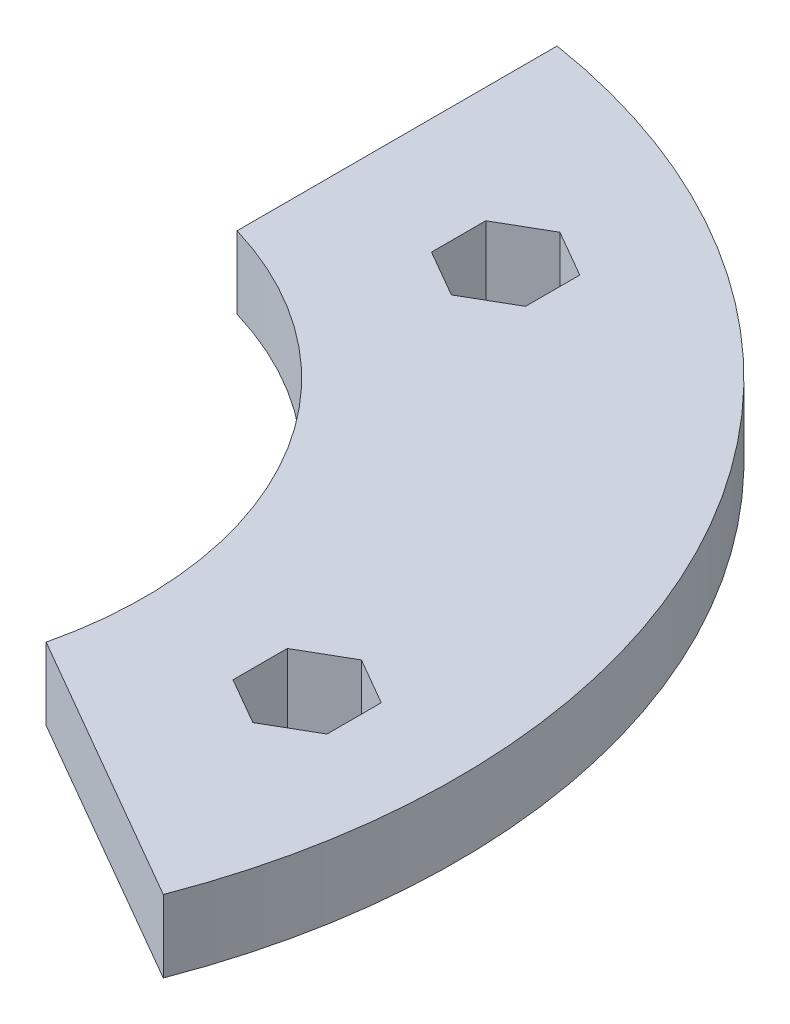
ISO-10303-21;
HEADER;
FILE_DESCRIPTION(('STEP AP214'),'2;1');
FILE_NAME('part.step','',(''),(''),'','','');
FILE_SCHEMA(('AUTOMOTIVE_DESIGN { 1 0 10303 214 1 1 1 1 }'));
ENDSEC;
DATA;
#1=APPLICATION_CONTEXT('core data for automotive mechanical design processes');
#2=APPLICATION_PROTOCOL_DEFINITION('international standard','automotive_design',2000,#1);
#3=PRODUCT_CONTEXT('',#1,'mechanical');
#4=PRODUCT('Part','Part','',(#3));
#5=PRODUCT_RELATED_PRODUCT_CATEGORY('part','',(#4));
#6=PRODUCT_DEFINITION_FORMATION('','',#4);
#7=PRODUCT_DEFINITION_CONTEXT('part definition',#1,'design');
#8=PRODUCT_DEFINITION('design','',#6,#7);
#9=PRODUCT_DEFINITION_SHAPE('','',#8);
#10=(LENGTH_UNIT() NAMED_UNIT(*) SI_UNIT(.MILLI.,.METRE.));
#11=(NAMED_UNIT(*) PLANE_ANGLE_UNIT() SI_UNIT($,.RADIAN.));
#12=(NAMED_UNIT(*) SI_UNIT($,.STERADIAN.) SOLID_ANGLE_UNIT());
#13=UNCERTAINTY_MEASURE_WITH_UNIT(LENGTH_MEASURE(1.E-05),#10,'distance_accuracy_value','');
#14=(GEOMETRIC_REPRESENTATION_CONTEXT(3) GLOBAL_UNCERTAINTY_ASSIGNED_CONTEXT((#13)) GLOBAL_UNIT_ASSIGNED_CONTEXT((#10,
#11,#12)) REPRESENTATION_CONTEXT('',''));
#15=CARTESIAN_POINT('',(0.,0.,0.));
#16=DIRECTION('',(0.,0.,1.));
#17=DIRECTION('',(1.,0.,0.));
#18=AXIS2_PLACEMENT_3D('',#15,#16,#17);
#19=CARTESIAN_POINT('',(0.,4.,0.));
#20=DIRECTION('',(0.,1.,0.));
#21=DIRECTION('',(0.,0.,1.));
#22=AXIS2_PLACEMENT_3D('',#19,#20,#21);
#23=PLANE('',#22);
#24=DIRECTION('',(0.,0.,1.));
#25=VECTOR('',#24,1.);
#26=CARTESIAN_POINT('',(12.4,4.,-27.4818728134262));
#27=LINE('',#26,#25);
#28=CARTESIAN_POINT('',(12.4,4.,-27.4818728134262));
#29=VERTEX_POINT('',#28);
#30=CARTESIAN_POINT('',(12.4,4.,-24.4796514136402));
#31=VERTEX_POINT('',#30);
#32=EDGE_CURVE('E258',#29,#31,#27,.T.);
#33=ORIENTED_EDGE('',*,*,#32,.F.);
#34=DIRECTION('',(-0.866025403784439,0.,0.5));
#35=VECTOR('',#34,1.);
#36=CARTESIAN_POINT('',(15.,4.,-28.9829835133192));
#37=LINE('',#36,#35);
#38=CARTESIAN_POINT('',(15.,4.,-28.9829835133192));
#39=VERTEX_POINT('',#38);
#40=EDGE_CURVE('E234',#39,#29,#37,.T.);
#41=ORIENTED_EDGE('',*,*,#40,.F.);
#42=DIRECTION('',(-0.866025403784441,0.,-0.499999999999997));
#43=VECTOR('',#42,1.);
#44=CARTESIAN_POINT('',(17.6,4.,-27.4818728134262));
#45=LINE('',#44,#43);
#46=CARTESIAN_POINT('',(17.6,4.,-27.4818728134262));
#47=VERTEX_POINT('',#46);
#48=EDGE_CURVE('E230',#47,#39,#45,.T.);
#49=ORIENTED_EDGE('',*,*,#48,.F.);
#50=DIRECTION('',(0.,0.,-1.));
#51=VECTOR('',#50,1.);
#52=CARTESIAN_POINT('',(17.6,4.,-24.4796514136402));
#53=LINE('',#52,#51);
#54=CARTESIAN_POINT('',(17.6,4.,-24.4796514136402));
#55=VERTEX_POINT('',#54);
#56=EDGE_CURVE('E251',#55,#47,#53,.T.);
#57=ORIENTED_EDGE('',*,*,#56,.F.);
#58=DIRECTION('',(0.866025403784438,0.,-0.5));
#59=VECTOR('',#58,1.);
#60=CARTESIAN_POINT('',(15.,4.,-22.9785407137471));
#61=LINE('',#60,#59);
#62=CARTESIAN_POINT('',(15.,4.,-22.9785407137471));
#63=VERTEX_POINT('',#62);
#64=EDGE_CURVE('E254',#63,#55,#61,.T.);
#65=ORIENTED_EDGE('',*,*,#64,.F.);
#66=DIRECTION('',(0.866025403784439,0.,0.499999999999999));
#67=VECTOR('',#66,1.);
#68=CARTESIAN_POINT('',(12.4,4.,-24.4796514136402));
#69=LINE('',#68,#67);
#70=EDGE_CURVE('E256',#31,#63,#69,.T.);
#71=ORIENTED_EDGE('',*,*,#70,.F.);
#72=EDGE_LOOP('',(#33,#41,#49,#57,#65,#71));
#73=FACE_BOUND('',#72,.T.);
#74=DIRECTION('',(-0.866025403784438,0.,0.5));
#75=VECTOR('',#74,1.);
#76=CARTESIAN_POINT('',(30.,4.,-3.00222139978605));
#77=LINE('',#76,#75);
#78=CARTESIAN_POINT('',(30.,4.,-3.00222139978605));
#79=VERTEX_POINT('',#78);
#80=CARTESIAN_POINT('',(27.4,4.,-1.50111069989303));
#81=VERTEX_POINT('',#80);
#82=EDGE_CURVE('E214',#79,#81,#77,.T.);
#83=ORIENTED_EDGE('',*,*,#82,.F.);
#84=DIRECTION('',(-0.866025403784439,0.,-0.5));
#85=VECTOR('',#84,1.);
#86=CARTESIAN_POINT('',(32.6,4.,-1.50111069989302));
#87=LINE('',#86,#85);
#88=CARTESIAN_POINT('',(32.6,4.,-1.50111069989302));
#89=VERTEX_POINT('',#88);
#90=EDGE_CURVE('E189',#89,#79,#87,.T.);
#91=ORIENTED_EDGE('',*,*,#90,.F.);
#92=DIRECTION('',(0.,0.,-1.));
#93=VECTOR('',#92,1.);
#94=CARTESIAN_POINT('',(32.6,4.,1.50111069989303));
#95=LINE('',#94,#93);
#96=CARTESIAN_POINT('',(32.6,4.,1.50111069989303));
#97=VERTEX_POINT('',#96);
#98=EDGE_CURVE('E185',#97,#89,#95,.T.);
#99=ORIENTED_EDGE('',*,*,#98,.F.);
#100=DIRECTION('',(0.866025403784439,0.,-0.5));
#101=VECTOR('',#100,1.);
#102=CARTESIAN_POINT('',(30.,4.,3.00222139978606));
#103=LINE('',#102,#101);
#104=CARTESIAN_POINT('',(30.,4.,3.00222139978606));
#105=VERTEX_POINT('',#104);
#106=EDGE_CURVE('E207',#105,#97,#103,.T.);
#107=ORIENTED_EDGE('',*,*,#106,.F.);
#108=DIRECTION('',(0.866025403784438,0.,0.5));
#109=VECTOR('',#108,1.);
#110=CARTESIAN_POINT('',(27.4,4.,1.50111069989303));
#111=LINE('',#110,#109);
#112=CARTESIAN_POINT('',(27.4,4.,1.50111069989303));
#113=VERTEX_POINT('',#112);
#114=EDGE_CURVE('E210',#113,#105,#111,.T.);
#115=ORIENTED_EDGE('',*,*,#114,.F.);
#116=DIRECTION('',(0.,0.,1.));
#117=VECTOR('',#116,1.);
#118=CARTESIAN_POINT('',(27.4,4.,-1.50111069989303));
#119=LINE('',#118,#117);
#120=EDGE_CURVE('E212',#81,#113,#119,.T.);
#121=ORIENTED_EDGE('',*,*,#120,.F.);
#122=EDGE_LOOP('',(#83,#91,#99,#107,#115,#121));
#123=FACE_BOUND('',#122,.T.);
#124=CARTESIAN_POINT('',(0.,4.,0.));
#125=DIRECTION('',(0.,1.,0.));
#126=DIRECTION('',(0.,0.,1.));
#127=AXIS2_PLACEMENT_3D('',#124,#125,#126);
#128=CIRCLE('',#127,38.3);
#129=CARTESIAN_POINT('',(35.7592353390612,4.,13.7174009187469));
#130=VERTEX_POINT('',#129);
#131=CARTESIAN_POINT('',(6.,4.,-37.8271066829066));
#132=VERTEX_POINT('',#131);
#133=EDGE_CURVE('E156',#130,#132,#128,.T.);
#134=ORIENTED_EDGE('',*,*,#133,.T.);
#135=DIRECTION('',(0.,0.,1.));
#136=VECTOR('',#135,1.);
#137=CARTESIAN_POINT('',(6.,4.,-50.2763023357895));
#138=LINE('',#137,#136);
#139=CARTESIAN_POINT('',(6.,4.,-20.1246117974981));
#140=VERTEX_POINT('',#139);
#141=EDGE_CURVE('E159',#132,#140,#138,.T.);
#142=ORIENTED_EDGE('',*,*,#141,.T.);
#143=CARTESIAN_POINT('',(0.,4.,0.));
#144=DIRECTION('',(0.,1.,0.));
#145=DIRECTION('',(0.,0.,1.));
#146=AXIS2_PLACEMENT_3D('',#143,#144,#145);
#147=CIRCLE('',#146,21.);
#148=CARTESIAN_POINT('',(20.4284250579334,4.,4.86615347604252));
#149=VERTEX_POINT('',#148);
#150=EDGE_CURVE('E158',#149,#140,#147,.T.);
#151=ORIENTED_EDGE('',*,*,#150,.F.);
#152=DIRECTION('',(0.866025403784436,0.,0.500000000000004));
#153=VECTOR('',#152,1.);
#154=CARTESIAN_POINT('',(15.3820042044027,4.,1.95260103781242));
#155=LINE('',#154,#153);
#156=EDGE_CURVE('E55',#149,#130,#155,.T.);
#157=ORIENTED_EDGE('',*,*,#156,.T.);
#158=EDGE_LOOP('',(#134,#142,#151,#157));
#159=FACE_BOUND('',#158,.T.);
#160=ADVANCED_FACE('F33',(#73,#123,#159),#23,.T.);
#161=CARTESIAN_POINT('',(0.,0.,0.));
#162=DIRECTION('',(0.,1.,0.));
#163=DIRECTION('',(0.,0.,1.));
#164=AXIS2_PLACEMENT_3D('',#161,#162,#163);
#165=PLANE('',#164);
#166=DIRECTION('',(-0.866025403784439,0.,0.5));
#167=VECTOR('',#166,1.);
#168=CARTESIAN_POINT('',(15.,0.,-28.9829835133192));
#169=LINE('',#168,#167);
#170=CARTESIAN_POINT('',(15.,0.,-28.9829835133192));
#171=VERTEX_POINT('',#170);
#172=CARTESIAN_POINT('',(12.4,0.,-27.4818728134262));
#173=VERTEX_POINT('',#172);
#174=EDGE_CURVE('E247',#171,#173,#169,.T.);
#175=ORIENTED_EDGE('',*,*,#174,.T.);
#176=DIRECTION('',(0.,0.,1.));
#177=VECTOR('',#176,1.);
#178=CARTESIAN_POINT('',(12.4,0.,-27.4818728134262));
#179=LINE('',#178,#177);
#180=CARTESIAN_POINT('',(12.4,0.,-24.4796514136402));
#181=VERTEX_POINT('',#180);
#182=EDGE_CURVE('E244',#173,#181,#179,.T.);
#183=ORIENTED_EDGE('',*,*,#182,.T.);
#184=DIRECTION('',(0.866025403784439,0.,0.499999999999999));
#185=VECTOR('',#184,1.);
#186=CARTESIAN_POINT('',(12.4,0.,-24.4796514136402));
#187=LINE('',#186,#185);
#188=CARTESIAN_POINT('',(15.,0.,-22.9785407137471));
#189=VERTEX_POINT('',#188);
#190=EDGE_CURVE('E241',#181,#189,#187,.T.);
#191=ORIENTED_EDGE('',*,*,#190,.T.);
#192=DIRECTION('',(0.866025403784438,0.,-0.5));
#193=VECTOR('',#192,1.);
#194=CARTESIAN_POINT('',(15.,0.,-22.9785407137471));
#195=LINE('',#194,#193);
#196=CARTESIAN_POINT('',(17.6,0.,-24.4796514136402));
#197=VERTEX_POINT('',#196);
#198=EDGE_CURVE('E238',#189,#197,#195,.T.);
#199=ORIENTED_EDGE('',*,*,#198,.T.);
#200=DIRECTION('',(0.,0.,-1.));
#201=VECTOR('',#200,1.);
#202=CARTESIAN_POINT('',(17.6,0.,-24.4796514136402));
#203=LINE('',#202,#201);
#204=CARTESIAN_POINT('',(17.6,0.,-27.4818728134262));
#205=VERTEX_POINT('',#204);
#206=EDGE_CURVE('E235',#197,#205,#203,.T.);
#207=ORIENTED_EDGE('',*,*,#206,.T.);
#208=DIRECTION('',(-0.866025403784441,0.,-0.499999999999997));
#209=VECTOR('',#208,1.);
#210=CARTESIAN_POINT('',(17.6,0.,-27.4818728134262));
#211=LINE('',#210,#209);
#212=EDGE_CURVE('E231',#205,#171,#211,.T.);
#213=ORIENTED_EDGE('',*,*,#212,.T.);
#214=EDGE_LOOP('',(#175,#183,#191,#199,#207,#213));
#215=FACE_BOUND('',#214,.T.);
#216=DIRECTION('',(-0.866025403784439,0.,-0.5));
#217=VECTOR('',#216,1.);
#218=CARTESIAN_POINT('',(32.6,0.,-1.50111069989302));
#219=LINE('',#218,#217);
#220=CARTESIAN_POINT('',(32.6,0.,-1.50111069989302));
#221=VERTEX_POINT('',#220);
#222=CARTESIAN_POINT('',(30.,0.,-3.00222139978605));
#223=VERTEX_POINT('',#222);
#224=EDGE_CURVE('E202',#221,#223,#219,.T.);
#225=ORIENTED_EDGE('',*,*,#224,.T.);
#226=DIRECTION('',(-0.866025403784438,0.,0.5));
#227=VECTOR('',#226,1.);
#228=CARTESIAN_POINT('',(30.,0.,-3.00222139978605));
#229=LINE('',#228,#227);
#230=CARTESIAN_POINT('',(27.4,0.,-1.50111069989303));
#231=VERTEX_POINT('',#230);
#232=EDGE_CURVE('E199',#223,#231,#229,.T.);
#233=ORIENTED_EDGE('',*,*,#232,.T.);
#234=DIRECTION('',(0.,0.,1.));
#235=VECTOR('',#234,1.);
#236=CARTESIAN_POINT('',(27.4,0.,-1.50111069989303));
#237=LINE('',#236,#235);
#238=CARTESIAN_POINT('',(27.4,0.,1.50111069989303));
#239=VERTEX_POINT('',#238);
#240=EDGE_CURVE('E196',#231,#239,#237,.T.);
#241=ORIENTED_EDGE('',*,*,#240,.T.);
#242=DIRECTION('',(0.866025403784438,0.,0.5));
#243=VECTOR('',#242,1.);
#244=CARTESIAN_POINT('',(27.4,0.,1.50111069989303));
#245=LINE('',#244,#243);
#246=CARTESIAN_POINT('',(30.,0.,3.00222139978606));
#247=VERTEX_POINT('',#246);
#248=EDGE_CURVE('E193',#239,#247,#245,.T.);
#249=ORIENTED_EDGE('',*,*,#248,.T.);
#250=DIRECTION('',(0.866025403784439,0.,-0.5));
#251=VECTOR('',#250,1.);
#252=CARTESIAN_POINT('',(30.,0.,3.00222139978606));
#253=LINE('',#252,#251);
#254=CARTESIAN_POINT('',(32.6,0.,1.50111069989303));
#255=VERTEX_POINT('',#254);
#256=EDGE_CURVE('E190',#247,#255,#253,.T.);
#257=ORIENTED_EDGE('',*,*,#256,.T.);
#258=DIRECTION('',(0.,0.,-1.));
#259=VECTOR('',#258,1.);
#260=CARTESIAN_POINT('',(32.6,0.,1.50111069989303));
#261=LINE('',#260,#259);
#262=EDGE_CURVE('E186',#255,#221,#261,.T.);
#263=ORIENTED_EDGE('',*,*,#262,.T.);
#264=EDGE_LOOP('',(#225,#233,#241,#249,#257,#263));
#265=FACE_BOUND('',#264,.T.);
#266=DIRECTION('',(0.,0.,1.));
#267=VECTOR('',#266,1.);
#268=CARTESIAN_POINT('',(6.00000000000001,0.,0.));
#269=LINE('',#268,#267);
#270=CARTESIAN_POINT('',(6.,0.,-37.8271066829066));
#271=VERTEX_POINT('',#270);
#272=CARTESIAN_POINT('',(6.,0.,-20.1246117974981));
#273=VERTEX_POINT('',#272);
#274=EDGE_CURVE('E48',#271,#273,#269,.T.);
#275=ORIENTED_EDGE('',*,*,#274,.F.);
#276=CARTESIAN_POINT('',(0.,0.,0.));
#277=DIRECTION('',(0.,1.,0.));
#278=DIRECTION('',(0.,0.,1.));
#279=AXIS2_PLACEMENT_3D('',#276,#277,#278);
#280=CIRCLE('',#279,38.3);
#281=CARTESIAN_POINT('',(35.7592353390612,0.,13.7174009187469));
#282=VERTEX_POINT('',#281);
#283=EDGE_CURVE('E163',#282,#271,#280,.T.);
#284=ORIENTED_EDGE('',*,*,#283,.F.);
#285=DIRECTION('',(0.866025403784436,0.,0.500000000000004));
#286=VECTOR('',#285,1.);
#287=CARTESIAN_POINT('',(3.00000000000002,0.,-5.19615242270662));
#288=LINE('',#287,#286);
#289=CARTESIAN_POINT('',(20.4284250579334,0.,4.86615347604252));
#290=VERTEX_POINT('',#289);
#291=EDGE_CURVE('E146',#290,#282,#288,.T.);
#292=ORIENTED_EDGE('',*,*,#291,.F.);
#293=CARTESIAN_POINT('',(0.,0.,0.));
#294=DIRECTION('',(0.,1.,0.));
#295=DIRECTION('',(0.,0.,1.));
#296=AXIS2_PLACEMENT_3D('',#293,#294,#295);
#297=CIRCLE('',#296,21.);
#298=EDGE_CURVE('E167',#290,#273,#297,.T.);
#299=ORIENTED_EDGE('',*,*,#298,.T.);
#300=EDGE_LOOP('',(#275,#284,#292,#299));
#301=FACE_BOUND('',#300,.T.);
#302=ADVANCED_FACE('F268',(#215,#265,#301),#165,.F.);
#303=CARTESIAN_POINT('',(0.,4.,0.));
#304=DIRECTION('',(0.,-1.,0.));
#305=DIRECTION('',(0.,0.,-1.));
#306=AXIS2_PLACEMENT_3D('',#303,#304,#305);
#307=CYLINDRICAL_SURFACE('',#306,38.3);
#308=DIRECTION('',(0.,-1.,0.));
#309=VECTOR('',#308,1.);
#310=CARTESIAN_POINT('',(6.,4.,-37.8271066829066));
#311=LINE('',#310,#309);
#312=EDGE_CURVE('E162',#132,#271,#311,.T.);
#313=ORIENTED_EDGE('',*,*,#312,.F.);
#314=ORIENTED_EDGE('',*,*,#133,.F.);
#315=DIRECTION('',(0.,-1.,0.));
#316=VECTOR('',#315,1.);
#317=CARTESIAN_POINT('',(35.7592353390612,4.,13.7174009187469));
#318=LINE('',#317,#316);
#319=EDGE_CURVE('E143',#282,#130,#318,.F.);
#320=ORIENTED_EDGE('',*,*,#319,.F.);
#321=ORIENTED_EDGE('',*,*,#283,.T.);
#322=EDGE_LOOP('',(#313,#314,#320,#321));
#323=FACE_BOUND('',#322,.T.);
#324=ADVANCED_FACE('F35',(#323),#307,.T.);
#325=CARTESIAN_POINT('',(0.,4.,0.));
#326=DIRECTION('',(0.,-1.,0.));
#327=DIRECTION('',(0.,0.,-1.));
#328=AXIS2_PLACEMENT_3D('',#325,#326,#327);
#329=CYLINDRICAL_SURFACE('',#328,21.);
#330=ORIENTED_EDGE('',*,*,#150,.T.);
#331=DIRECTION('',(0.,-1.,0.));
#332=VECTOR('',#331,1.);
#333=CARTESIAN_POINT('',(6.,4.,-20.1246117974981));
#334=LINE('',#333,#332);
#335=EDGE_CURVE('E11',#140,#273,#334,.T.);
#336=ORIENTED_EDGE('',*,*,#335,.T.);
#337=ORIENTED_EDGE('',*,*,#298,.F.);
#338=DIRECTION('',(0.,-1.,0.));
#339=VECTOR('',#338,1.);
#340=CARTESIAN_POINT('',(20.4284250579334,4.,4.86615347604252));
#341=LINE('',#340,#339);
#342=EDGE_CURVE('E41',#290,#149,#341,.F.);
#343=ORIENTED_EDGE('',*,*,#342,.T.);
#344=EDGE_LOOP('',(#330,#336,#337,#343));
#345=FACE_BOUND('',#344,.T.);
#346=ADVANCED_FACE('F265',(#345),#329,.F.);
#347=CARTESIAN_POINT('',(32.6,4.,-1.50111069989302));
#348=DIRECTION('',(-0.5,0.,0.866025403784439));
#349=DIRECTION('',(0.866025403784439,0.,0.5));
#350=AXIS2_PLACEMENT_3D('',#347,#348,#349);
#351=PLANE('',#350);
#352=ORIENTED_EDGE('',*,*,#224,.F.);
#353=DIRECTION('',(0.,-1.,0.));
#354=VECTOR('',#353,1.);
#355=CARTESIAN_POINT('',(32.6,4.,-1.50111069989302));
#356=LINE('',#355,#354);
#357=EDGE_CURVE('E182',#89,#221,#356,.T.);
#358=ORIENTED_EDGE('',*,*,#357,.F.);
#359=ORIENTED_EDGE('',*,*,#90,.T.);
#360=DIRECTION('',(0.,-1.,0.));
#361=VECTOR('',#360,1.);
#362=CARTESIAN_POINT('',(30.,4.,-3.00222139978605));
#363=LINE('',#362,#361);
#364=EDGE_CURVE('E170',#79,#223,#363,.T.);
#365=ORIENTED_EDGE('',*,*,#364,.T.);
#366=EDGE_LOOP('',(#352,#358,#359,#365));
#367=FACE_BOUND('',#366,.T.);
#368=ADVANCED_FACE('F281',(#367),#351,.T.);
#369=CARTESIAN_POINT('',(30.,4.,-3.00222139978605));
#370=DIRECTION('',(0.5,0.,0.866025403784439));
#371=DIRECTION('',(0.866025403784438,0.,-0.5));
#372=AXIS2_PLACEMENT_3D('',#369,#370,#371);
#373=PLANE('',#372);
#374=ORIENTED_EDGE('',*,*,#232,.F.);
#375=ORIENTED_EDGE('',*,*,#364,.F.);
#376=ORIENTED_EDGE('',*,*,#82,.T.);
#377=DIRECTION('',(0.,-1.,0.));
#378=VECTOR('',#377,1.);
#379=CARTESIAN_POINT('',(27.4,4.,-1.50111069989303));
#380=LINE('',#379,#378);
#381=EDGE_CURVE('E174',#81,#231,#380,.T.);
#382=ORIENTED_EDGE('',*,*,#381,.T.);
#383=EDGE_LOOP('',(#374,#375,#376,#382));
#384=FACE_BOUND('',#383,.T.);
#385=ADVANCED_FACE('F284',(#384),#373,.T.);
#386=CARTESIAN_POINT('',(27.4,4.,-1.50111069989303));
#387=DIRECTION('',(1.,0.,0.));
#388=DIRECTION('',(0.,0.,-1.));
#389=AXIS2_PLACEMENT_3D('',#386,#387,#388);
#390=PLANE('',#389);
#391=ORIENTED_EDGE('',*,*,#240,.F.);
#392=ORIENTED_EDGE('',*,*,#381,.F.);
#393=ORIENTED_EDGE('',*,*,#120,.T.);
#394=DIRECTION('',(0.,-1.,0.));
#395=VECTOR('',#394,1.);
#396=CARTESIAN_POINT('',(27.4,4.,1.50111069989303));
#397=LINE('',#396,#395);
#398=EDGE_CURVE('E176',#113,#239,#397,.T.);
#399=ORIENTED_EDGE('',*,*,#398,.T.);
#400=EDGE_LOOP('',(#391,#392,#393,#399));
#401=FACE_BOUND('',#400,.T.);
#402=ADVANCED_FACE('F288',(#401),#390,.T.);
#403=CARTESIAN_POINT('',(27.4,4.,1.50111069989303));
#404=DIRECTION('',(0.5,0.,-0.866025403784439));
#405=DIRECTION('',(-0.866025403784439,0.,-0.5));
#406=AXIS2_PLACEMENT_3D('',#403,#404,#405);
#407=PLANE('',#406);
#408=ORIENTED_EDGE('',*,*,#248,.F.);
#409=ORIENTED_EDGE('',*,*,#398,.F.);
#410=ORIENTED_EDGE('',*,*,#114,.T.);
#411=DIRECTION('',(0.,-1.,0.));
#412=VECTOR('',#411,1.);
#413=CARTESIAN_POINT('',(30.,4.,3.00222139978606));
#414=LINE('',#413,#412);
#415=EDGE_CURVE('E178',#105,#247,#414,.T.);
#416=ORIENTED_EDGE('',*,*,#415,.T.);
#417=EDGE_LOOP('',(#408,#409,#410,#416));
#418=FACE_BOUND('',#417,.T.);
#419=ADVANCED_FACE('F292',(#418),#407,.T.);
#420=CARTESIAN_POINT('',(30.,4.,3.00222139978606));
#421=DIRECTION('',(-0.5,0.,-0.866025403784439));
#422=DIRECTION('',(-0.866025403784439,0.,0.5));
#423=AXIS2_PLACEMENT_3D('',#420,#421,#422);
#424=PLANE('',#423);
#425=ORIENTED_EDGE('',*,*,#256,.F.);
#426=ORIENTED_EDGE('',*,*,#415,.F.);
#427=ORIENTED_EDGE('',*,*,#106,.T.);
#428=DIRECTION('',(0.,-1.,0.));
#429=VECTOR('',#428,1.);
#430=CARTESIAN_POINT('',(32.6,4.,1.50111069989303));
#431=LINE('',#430,#429);
#432=EDGE_CURVE('E180',#97,#255,#431,.T.);
#433=ORIENTED_EDGE('',*,*,#432,.T.);
#434=EDGE_LOOP('',(#425,#426,#427,#433));
#435=FACE_BOUND('',#434,.T.);
#436=ADVANCED_FACE('F296',(#435),#424,.T.);
#437=CARTESIAN_POINT('',(32.6,4.,1.50111069989303));
#438=DIRECTION('',(-1.,0.,0.));
#439=DIRECTION('',(0.,0.,1.));
#440=AXIS2_PLACEMENT_3D('',#437,#438,#439);
#441=PLANE('',#440);
#442=ORIENTED_EDGE('',*,*,#262,.F.);
#443=ORIENTED_EDGE('',*,*,#432,.F.);
#444=ORIENTED_EDGE('',*,*,#98,.T.);
#445=ORIENTED_EDGE('',*,*,#357,.T.);
#446=EDGE_LOOP('',(#442,#443,#444,#445));
#447=FACE_BOUND('',#446,.T.);
#448=ADVANCED_FACE('F300',(#447),#441,.T.);
#449=CARTESIAN_POINT('',(15.,4.,-28.9829835133192));
#450=DIRECTION('',(0.5,0.,0.866025403784439));
#451=DIRECTION('',(0.866025403784439,0.,-0.5));
#452=AXIS2_PLACEMENT_3D('',#449,#450,#451);
#453=PLANE('',#452);
#454=ORIENTED_EDGE('',*,*,#174,.F.);
#455=DIRECTION('',(0.,-1.,0.));
#456=VECTOR('',#455,1.);
#457=CARTESIAN_POINT('',(15.,4.,-28.9829835133192));
#458=LINE('',#457,#456);
#459=EDGE_CURVE('E227',#39,#171,#458,.T.);
#460=ORIENTED_EDGE('',*,*,#459,.F.);
#461=ORIENTED_EDGE('',*,*,#40,.T.);
#462=DIRECTION('',(0.,-1.,0.));
#463=VECTOR('',#462,1.);
#464=CARTESIAN_POINT('',(12.4,4.,-27.4818728134262));
#465=LINE('',#464,#463);
#466=EDGE_CURVE('E205',#29,#173,#465,.T.);
#467=ORIENTED_EDGE('',*,*,#466,.T.);
#468=EDGE_LOOP('',(#454,#460,#461,#467));
#469=FACE_BOUND('',#468,.T.);
#470=ADVANCED_FACE('F304',(#469),#453,.T.);
#471=CARTESIAN_POINT('',(12.4,4.,-27.4818728134262));
#472=DIRECTION('',(1.,0.,0.));
#473=DIRECTION('',(0.,0.,-1.));
#474=AXIS2_PLACEMENT_3D('',#471,#472,#473);
#475=PLANE('',#474);
#476=ORIENTED_EDGE('',*,*,#182,.F.);
#477=ORIENTED_EDGE('',*,*,#466,.F.);
#478=ORIENTED_EDGE('',*,*,#32,.T.);
#479=DIRECTION('',(0.,-1.,0.));
#480=VECTOR('',#479,1.);
#481=CARTESIAN_POINT('',(12.4,4.,-24.4796514136402));
#482=LINE('',#481,#480);
#483=EDGE_CURVE('E219',#31,#181,#482,.T.);
#484=ORIENTED_EDGE('',*,*,#483,.T.);
#485=EDGE_LOOP('',(#476,#477,#478,#484));
#486=FACE_BOUND('',#485,.T.);
#487=ADVANCED_FACE('F308',(#486),#475,.T.);
#488=CARTESIAN_POINT('',(12.4,4.,-24.4796514136402));
#489=DIRECTION('',(0.499999999999999,0.,-0.866025403784439));
#490=DIRECTION('',(-0.866025403784439,0.,-0.499999999999999));
#491=AXIS2_PLACEMENT_3D('',#488,#489,#490);
#492=PLANE('',#491);
#493=ORIENTED_EDGE('',*,*,#190,.F.);
#494=ORIENTED_EDGE('',*,*,#483,.F.);
#495=ORIENTED_EDGE('',*,*,#70,.T.);
#496=DIRECTION('',(0.,-1.,0.));
#497=VECTOR('',#496,1.);
#498=CARTESIAN_POINT('',(15.,4.,-22.9785407137471));
#499=LINE('',#498,#497);
#500=EDGE_CURVE('E221',#63,#189,#499,.T.);
#501=ORIENTED_EDGE('',*,*,#500,.T.);
#502=EDGE_LOOP('',(#493,#494,#495,#501));
#503=FACE_BOUND('',#502,.T.);
#504=ADVANCED_FACE('F312',(#503),#492,.T.);
#505=CARTESIAN_POINT('',(15.,4.,-22.9785407137471));
#506=DIRECTION('',(-0.5,0.,-0.866025403784439));
#507=DIRECTION('',(-0.866025403784438,0.,0.5));
#508=AXIS2_PLACEMENT_3D('',#505,#506,#507);
#509=PLANE('',#508);
#510=ORIENTED_EDGE('',*,*,#198,.F.);
#511=ORIENTED_EDGE('',*,*,#500,.F.);
#512=ORIENTED_EDGE('',*,*,#64,.T.);
#513=DIRECTION('',(0.,-1.,0.));
#514=VECTOR('',#513,1.);
#515=CARTESIAN_POINT('',(17.6,4.,-24.4796514136402));
#516=LINE('',#515,#514);
#517=EDGE_CURVE('E223',#55,#197,#516,.T.);
#518=ORIENTED_EDGE('',*,*,#517,.T.);
#519=EDGE_LOOP('',(#510,#511,#512,#518));
#520=FACE_BOUND('',#519,.T.);
#521=ADVANCED_FACE('F316',(#520),#509,.T.);
#522=CARTESIAN_POINT('',(17.6,4.,-24.4796514136402));
#523=DIRECTION('',(-1.,0.,0.));
#524=DIRECTION('',(0.,0.,1.));
#525=AXIS2_PLACEMENT_3D('',#522,#523,#524);
#526=PLANE('',#525);
#527=ORIENTED_EDGE('',*,*,#206,.F.);
#528=ORIENTED_EDGE('',*,*,#517,.F.);
#529=ORIENTED_EDGE('',*,*,#56,.T.);
#530=DIRECTION('',(0.,-1.,0.));
#531=VECTOR('',#530,1.);
#532=CARTESIAN_POINT('',(17.6,4.,-27.4818728134262));
#533=LINE('',#532,#531);
#534=EDGE_CURVE('E225',#47,#205,#533,.T.);
#535=ORIENTED_EDGE('',*,*,#534,.T.);
#536=EDGE_LOOP('',(#527,#528,#529,#535));
#537=FACE_BOUND('',#536,.T.);
#538=ADVANCED_FACE('F320',(#537),#526,.T.);
#539=CARTESIAN_POINT('',(17.6,4.,-27.4818728134262));
#540=DIRECTION('',(-0.499999999999997,0.,0.866025403784441));
#541=DIRECTION('',(0.866025403784441,0.,0.499999999999997));
#542=AXIS2_PLACEMENT_3D('',#539,#540,#541);
#543=PLANE('',#542);
#544=ORIENTED_EDGE('',*,*,#212,.F.);
#545=ORIENTED_EDGE('',*,*,#534,.F.);
#546=ORIENTED_EDGE('',*,*,#48,.T.);
#547=ORIENTED_EDGE('',*,*,#459,.T.);
#548=EDGE_LOOP('',(#544,#545,#546,#547));
#549=FACE_BOUND('',#548,.T.);
#550=ADVANCED_FACE('F324',(#549),#543,.T.);
#551=CARTESIAN_POINT('',(15.3820042044027,-6.,1.95260103781242));
#552=DIRECTION('',(-0.500000000000004,0.,0.866025403784436));
#553=DIRECTION('',(0.866025403784436,0.,0.500000000000004));
#554=AXIS2_PLACEMENT_3D('',#551,#552,#553);
#555=PLANE('',#554);
#556=ORIENTED_EDGE('',*,*,#319,.T.);
#557=ORIENTED_EDGE('',*,*,#156,.F.);
#558=ORIENTED_EDGE('',*,*,#342,.F.);
#559=ORIENTED_EDGE('',*,*,#291,.T.);
#560=EDGE_LOOP('',(#556,#557,#558,#559));
#561=FACE_BOUND('',#560,.T.);
#562=ADVANCED_FACE('F144',(#561),#555,.T.);
#563=CARTESIAN_POINT('',(6.,-6.,-50.2763023357895));
#564=DIRECTION('',(-1.,0.,0.));
#565=DIRECTION('',(0.,0.,1.));
#566=AXIS2_PLACEMENT_3D('',#563,#564,#565);
#567=PLANE('',#566);
#568=ORIENTED_EDGE('',*,*,#312,.T.);
#569=ORIENTED_EDGE('',*,*,#274,.T.);
#570=ORIENTED_EDGE('',*,*,#335,.F.);
#571=ORIENTED_EDGE('',*,*,#141,.F.);
#572=EDGE_LOOP('',(#568,#569,#570,#571));
#573=FACE_BOUND('',#572,.T.);
#574=ADVANCED_FACE('F331',(#573),#567,.T.);
#575=CLOSED_SHELL('',(#160,#302,#324,#346,#368,#385,#402,#419,#436,#448,#470,#487,#504,#521,
#538,#550,#562,#574));
#576=MANIFOLD_SOLID_BREP('B2',#575);
#577=ADVANCED_BREP_SHAPE_REPRESENTATION('',(#18,#576),#14);
#578=SHAPE_DEFINITION_REPRESENTATION(#9,#577);
ENDSEC;
END-ISO-10303-21;
